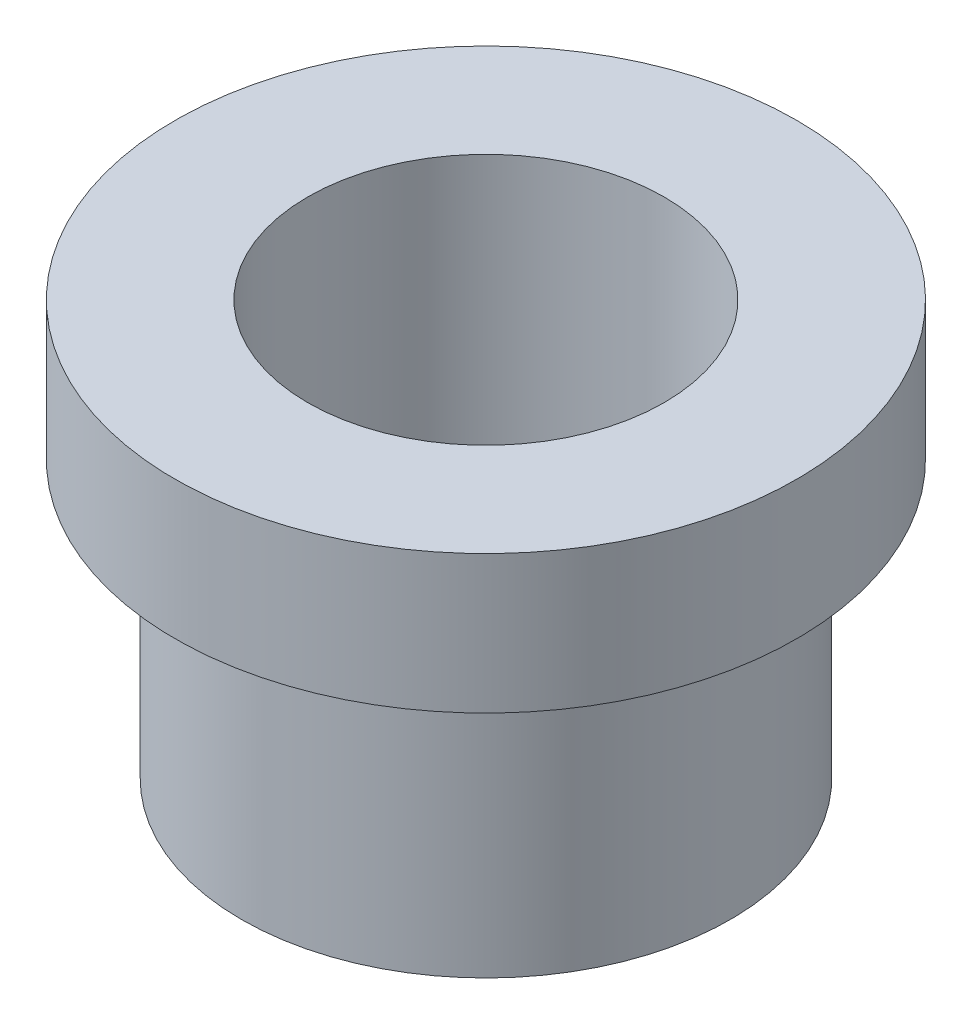
ISO-10303-21;
HEADER;
FILE_DESCRIPTION(('STEP AP214'),'2;1');
FILE_NAME('part.step','',(''),(''),'','','');
FILE_SCHEMA(('AUTOMOTIVE_DESIGN { 1 0 10303 214 1 1 1 1 }'));
ENDSEC;
DATA;
#1=APPLICATION_CONTEXT('core data for automotive mechanical design processes');
#2=APPLICATION_PROTOCOL_DEFINITION('international standard','automotive_design',2000,#1);
#3=PRODUCT_CONTEXT('',#1,'mechanical');
#4=PRODUCT('Part','Part','',(#3));
#5=PRODUCT_RELATED_PRODUCT_CATEGORY('part','',(#4));
#6=PRODUCT_DEFINITION_FORMATION('','',#4);
#7=PRODUCT_DEFINITION_CONTEXT('part definition',#1,'design');
#8=PRODUCT_DEFINITION('design','',#6,#7);
#9=PRODUCT_DEFINITION_SHAPE('','',#8);
#10=(LENGTH_UNIT() NAMED_UNIT(*) SI_UNIT(.MILLI.,.METRE.));
#11=(NAMED_UNIT(*) PLANE_ANGLE_UNIT() SI_UNIT($,.RADIAN.));
#12=(NAMED_UNIT(*) SI_UNIT($,.STERADIAN.) SOLID_ANGLE_UNIT());
#13=UNCERTAINTY_MEASURE_WITH_UNIT(LENGTH_MEASURE(1.E-05),#10,'distance_accuracy_value','');
#14=(GEOMETRIC_REPRESENTATION_CONTEXT(3) GLOBAL_UNCERTAINTY_ASSIGNED_CONTEXT((#13)) GLOBAL_UNIT_ASSIGNED_CONTEXT((#10,
#11,#12)) REPRESENTATION_CONTEXT('',''));
#15=CARTESIAN_POINT('',(0.,0.,0.));
#16=DIRECTION('',(0.,0.,1.));
#17=DIRECTION('',(1.,0.,0.));
#18=AXIS2_PLACEMENT_3D('',#15,#16,#17);
#19=CARTESIAN_POINT('',(0.,12.7,0.));
#20=DIRECTION('',(0.,1.,0.));
#21=DIRECTION('',(0.,0.,1.));
#22=AXIS2_PLACEMENT_3D('',#19,#20,#21);
#23=PLANE('',#22);
#24=CARTESIAN_POINT('',(0.,12.7,0.));
#25=DIRECTION('',(0.,1.,0.));
#26=DIRECTION('',(0.,0.,1.));
#27=AXIS2_PLACEMENT_3D('',#24,#25,#26);
#28=CIRCLE('',#27,28.575);
#29=CARTESIAN_POINT('',(0.,12.7,-28.575));
#30=VERTEX_POINT('',#29);
#31=EDGE_CURVE('E11',#30,#30,#28,.T.);
#32=ORIENTED_EDGE('',*,*,#31,.T.);
#33=EDGE_LOOP('',(#32));
#34=FACE_BOUND('',#33,.T.);
#35=CARTESIAN_POINT('',(0.,12.7,0.));
#36=DIRECTION('',(0.,1.,0.));
#37=DIRECTION('',(0.,0.,1.));
#38=AXIS2_PLACEMENT_3D('',#35,#36,#37);
#39=CIRCLE('',#38,16.383);
#40=CARTESIAN_POINT('',(0.,12.7,-16.383));
#41=VERTEX_POINT('',#40);
#42=EDGE_CURVE('E62',#41,#41,#39,.T.);
#43=ORIENTED_EDGE('',*,*,#42,.F.);
#44=EDGE_LOOP('',(#43));
#45=FACE_BOUND('',#44,.T.);
#46=ADVANCED_FACE('F49',(#34,#45),#23,.T.);
#47=CARTESIAN_POINT('',(0.,0.,0.));
#48=DIRECTION('',(0.,1.,0.));
#49=DIRECTION('',(0.,0.,1.));
#50=AXIS2_PLACEMENT_3D('',#47,#48,#49);
#51=PLANE('',#50);
#52=CARTESIAN_POINT('',(0.,0.,0.));
#53=DIRECTION('',(0.,1.,0.));
#54=DIRECTION('',(0.,0.,1.));
#55=AXIS2_PLACEMENT_3D('',#52,#53,#54);
#56=CIRCLE('',#55,22.479);
#57=CARTESIAN_POINT('',(0.,0.,22.479));
#58=VERTEX_POINT('',#57);
#59=EDGE_CURVE('E68',#58,#58,#56,.T.);
#60=ORIENTED_EDGE('',*,*,#59,.T.);
#61=EDGE_LOOP('',(#60));
#62=FACE_BOUND('',#61,.T.);
#63=CARTESIAN_POINT('',(0.,0.,0.));
#64=DIRECTION('',(0.,1.,0.));
#65=DIRECTION('',(0.,0.,1.));
#66=AXIS2_PLACEMENT_3D('',#63,#64,#65);
#67=CIRCLE('',#66,28.575);
#68=CARTESIAN_POINT('',(0.,0.,-28.575));
#69=VERTEX_POINT('',#68);
#70=EDGE_CURVE('E53',#69,#69,#67,.T.);
#71=ORIENTED_EDGE('',*,*,#70,.F.);
#72=EDGE_LOOP('',(#71));
#73=FACE_BOUND('',#72,.T.);
#74=ADVANCED_FACE('F95',(#62,#73),#51,.F.);
#75=CARTESIAN_POINT('',(0.,12.7,0.));
#76=DIRECTION('',(0.,-1.,0.));
#77=DIRECTION('',(0.,0.,-1.));
#78=AXIS2_PLACEMENT_3D('',#75,#76,#77);
#79=CYLINDRICAL_SURFACE('',#78,28.575);
#80=CARTESIAN_POINT('',(0.,12.7,-28.575));
#81=CARTESIAN_POINT('',(0.,12.5677083333333,-28.575));
#82=CARTESIAN_POINT('',(0.,12.4354166666667,-28.575));
#83=CARTESIAN_POINT('',(0.,12.1708333333333,-28.575));
#84=CARTESIAN_POINT('',(0.,12.0385416666667,-28.575));
#85=CARTESIAN_POINT('',(0.,11.7739583333333,-28.575));
#86=CARTESIAN_POINT('',(0.,11.6416666666667,-28.575));
#87=CARTESIAN_POINT('',(0.,11.3770833333333,-28.575));
#88=CARTESIAN_POINT('',(0.,11.2447916666667,-28.575));
#89=CARTESIAN_POINT('',(0.,10.9802083333333,-28.575));
#90=CARTESIAN_POINT('',(0.,10.8479166666667,-28.575));
#91=CARTESIAN_POINT('',(0.,10.5833333333333,-28.575));
#92=CARTESIAN_POINT('',(0.,10.4510416666667,-28.575));
#93=CARTESIAN_POINT('',(0.,10.1864583333333,-28.575));
#94=CARTESIAN_POINT('',(0.,10.0541666666667,-28.575));
#95=CARTESIAN_POINT('',(0.,9.78958333333333,-28.575));
#96=CARTESIAN_POINT('',(0.,9.65729166666667,-28.575));
#97=CARTESIAN_POINT('',(0.,9.39270833333333,-28.575));
#98=CARTESIAN_POINT('',(0.,9.26041666666667,-28.575));
#99=CARTESIAN_POINT('',(0.,8.99583333333334,-28.575));
#100=CARTESIAN_POINT('',(0.,8.86354166666667,-28.575));
#101=CARTESIAN_POINT('',(0.,8.59895833333334,-28.575));
#102=CARTESIAN_POINT('',(0.,8.46666666666667,-28.575));
#103=CARTESIAN_POINT('',(0.,8.20208333333333,-28.575));
#104=CARTESIAN_POINT('',(0.,8.06979166666667,-28.575));
#105=CARTESIAN_POINT('',(0.,7.80520833333333,-28.575));
#106=CARTESIAN_POINT('',(0.,7.67291666666667,-28.575));
#107=CARTESIAN_POINT('',(0.,7.40833333333333,-28.575));
#108=CARTESIAN_POINT('',(0.,7.27604166666667,-28.575));
#109=CARTESIAN_POINT('',(0.,7.01145833333333,-28.575));
#110=CARTESIAN_POINT('',(0.,6.87916666666667,-28.575));
#111=CARTESIAN_POINT('',(0.,6.61458333333333,-28.575));
#112=CARTESIAN_POINT('',(0.,6.48229166666667,-28.575));
#113=CARTESIAN_POINT('',(0.,6.21770833333333,-28.575));
#114=CARTESIAN_POINT('',(0.,6.08541666666667,-28.575));
#115=CARTESIAN_POINT('',(0.,5.82083333333333,-28.575));
#116=CARTESIAN_POINT('',(0.,5.68854166666667,-28.575));
#117=CARTESIAN_POINT('',(0.,5.42395833333333,-28.575));
#118=CARTESIAN_POINT('',(0.,5.29166666666667,-28.575));
#119=CARTESIAN_POINT('',(0.,5.02708333333333,-28.575));
#120=CARTESIAN_POINT('',(0.,4.89479166666667,-28.575));
#121=CARTESIAN_POINT('',(0.,4.63020833333333,-28.575));
#122=CARTESIAN_POINT('',(0.,4.49791666666667,-28.575));
#123=CARTESIAN_POINT('',(0.,4.23333333333333,-28.575));
#124=CARTESIAN_POINT('',(0.,4.10104166666667,-28.575));
#125=CARTESIAN_POINT('',(0.,3.83645833333333,-28.575));
#126=CARTESIAN_POINT('',(0.,3.70416666666667,-28.575));
#127=CARTESIAN_POINT('',(0.,3.43958333333333,-28.575));
#128=CARTESIAN_POINT('',(0.,3.30729166666667,-28.575));
#129=CARTESIAN_POINT('',(0.,3.04270833333333,-28.575));
#130=CARTESIAN_POINT('',(0.,2.91041666666667,-28.575));
#131=CARTESIAN_POINT('',(0.,2.64583333333333,-28.575));
#132=CARTESIAN_POINT('',(0.,2.51354166666667,-28.575));
#133=CARTESIAN_POINT('',(0.,2.24895833333333,-28.575));
#134=CARTESIAN_POINT('',(0.,2.11666666666667,-28.575));
#135=CARTESIAN_POINT('',(0.,1.85208333333333,-28.575));
#136=CARTESIAN_POINT('',(0.,1.71979166666667,-28.575));
#137=CARTESIAN_POINT('',(0.,1.45520833333333,-28.575));
#138=CARTESIAN_POINT('',(0.,1.32291666666667,-28.575));
#139=CARTESIAN_POINT('',(0.,1.05833333333333,-28.575));
#140=CARTESIAN_POINT('',(0.,0.926041666666666,-28.575));
#141=CARTESIAN_POINT('',(0.,0.661458333333333,-28.575));
#142=CARTESIAN_POINT('',(0.,0.529166666666666,-28.575));
#143=CARTESIAN_POINT('',(0.,0.264583333333333,-28.575));
#144=CARTESIAN_POINT('',(0.,0.132291666666667,-28.575));
#145=CARTESIAN_POINT('',(0.,0.,-28.575));
#146=B_SPLINE_CURVE_WITH_KNOTS('',3,(#80,#81,#82,#83,#84,#85,#86,#87,#88,#89,#90,#91,#92,#93,
#94,#95,#96,#97,#98,#99,#100,#101,#102,#103,#104,#105,#106,#107,#108,#109,#110,#111,#112,#113,
#114,#115,#116,#117,#118,#119,#120,#121,#122,#123,#124,#125,#126,#127,#128,#129,#130,#131,#132,
#133,#134,#135,#136,#137,#138,#139,#140,#141,#142,#143,#144,#145),.UNSPECIFIED.,.F.,.F.,(4,2,2,
2,2,2,2,2,2,2,2,2,2,2,2,2,2,2,2,2,2,2,2,2,2,2,2,2,2,2,2,2,4),(0.,0.396875,0.793749999999999,
1.190625,1.5875,1.984375,2.38125,2.778125,3.175,3.571875,3.96875,4.365625,4.7625,5.159375,
5.55625,5.953125,6.35,6.746875,7.14375,7.540625,7.9375,8.334375,8.73125,9.128125,9.525,9.921875,
10.31875,10.715625,11.1125,11.509375,11.90625,12.303125,12.7),.UNSPECIFIED.);
#147=EDGE_CURVE('BSEAM51',#30,#69,#146,.T.);
#148=ORIENTED_EDGE('',*,*,#31,.F.);
#149=ORIENTED_EDGE('',*,*,#70,.T.);
#150=ORIENTED_EDGE('',*,*,#147,.T.);
#151=ORIENTED_EDGE('',*,*,#147,.F.);
#152=EDGE_LOOP('',(#148,#150,#149,#151));
#153=FACE_BOUND('',#152,.T.);
#154=ADVANCED_FACE('F51',(#153),#79,.T.);
#155=CARTESIAN_POINT('',(0.,12.7,0.));
#156=DIRECTION('',(0.,-1.,0.));
#157=DIRECTION('',(0.,0.,-1.));
#158=AXIS2_PLACEMENT_3D('',#155,#156,#157);
#159=CYLINDRICAL_SURFACE('',#158,16.383);
#160=CARTESIAN_POINT('',(0.,-25.4,0.));
#161=DIRECTION('',(0.,1.,0.));
#162=DIRECTION('',(0.,0.,1.));
#163=AXIS2_PLACEMENT_3D('',#160,#161,#162);
#164=CIRCLE('',#163,16.383);
#165=CARTESIAN_POINT('',(0.,-25.4,-16.383));
#166=VERTEX_POINT('',#165);
#167=EDGE_CURVE('E72',#166,#166,#164,.T.);
#168=CARTESIAN_POINT('',(0.,12.7,-16.383));
#169=CARTESIAN_POINT('',(0.,12.303125,-16.383));
#170=CARTESIAN_POINT('',(0.,11.90625,-16.383));
#171=CARTESIAN_POINT('',(0.,11.1125,-16.383));
#172=CARTESIAN_POINT('',(0.,10.715625,-16.383));
#173=CARTESIAN_POINT('',(0.,9.921875,-16.383));
#174=CARTESIAN_POINT('',(0.,9.525,-16.383));
#175=CARTESIAN_POINT('',(0.,8.73125,-16.383));
#176=CARTESIAN_POINT('',(0.,8.334375,-16.383));
#177=CARTESIAN_POINT('',(0.,7.540625,-16.383));
#178=CARTESIAN_POINT('',(0.,7.14375,-16.383));
#179=CARTESIAN_POINT('',(0.,6.35,-16.383));
#180=CARTESIAN_POINT('',(0.,5.953125,-16.383));
#181=CARTESIAN_POINT('',(0.,5.159375,-16.383));
#182=CARTESIAN_POINT('',(0.,4.7625,-16.383));
#183=CARTESIAN_POINT('',(0.,3.96875,-16.383));
#184=CARTESIAN_POINT('',(0.,3.571875,-16.383));
#185=CARTESIAN_POINT('',(0.,2.778125,-16.383));
#186=CARTESIAN_POINT('',(0.,2.38125,-16.383));
#187=CARTESIAN_POINT('',(0.,1.5875,-16.383));
#188=CARTESIAN_POINT('',(0.,1.190625,-16.383));
#189=CARTESIAN_POINT('',(0.,0.396875,-16.383));
#190=CARTESIAN_POINT('',(0.,0.,-16.383));
#191=CARTESIAN_POINT('',(0.,-0.79375,-16.383));
#192=CARTESIAN_POINT('',(0.,-1.190625,-16.383));
#193=CARTESIAN_POINT('',(0.,-1.984375,-16.383));
#194=CARTESIAN_POINT('',(0.,-2.38125,-16.383));
#195=CARTESIAN_POINT('',(0.,-3.175,-16.383));
#196=CARTESIAN_POINT('',(0.,-3.571875,-16.383));
#197=CARTESIAN_POINT('',(0.,-4.365625,-16.383));
#198=CARTESIAN_POINT('',(0.,-4.7625,-16.383));
#199=CARTESIAN_POINT('',(0.,-5.55625,-16.383));
#200=CARTESIAN_POINT('',(0.,-5.953125,-16.383));
#201=CARTESIAN_POINT('',(0.,-6.746875,-16.383));
#202=CARTESIAN_POINT('',(0.,-7.14375,-16.383));
#203=CARTESIAN_POINT('',(0.,-7.9375,-16.383));
#204=CARTESIAN_POINT('',(0.,-8.334375,-16.383));
#205=CARTESIAN_POINT('',(0.,-9.128125,-16.383));
#206=CARTESIAN_POINT('',(0.,-9.525,-16.383));
#207=CARTESIAN_POINT('',(0.,-10.31875,-16.383));
#208=CARTESIAN_POINT('',(0.,-10.715625,-16.383));
#209=CARTESIAN_POINT('',(0.,-11.509375,-16.383));
#210=CARTESIAN_POINT('',(0.,-11.90625,-16.383));
#211=CARTESIAN_POINT('',(0.,-12.7,-16.383));
#212=CARTESIAN_POINT('',(0.,-13.096875,-16.383));
#213=CARTESIAN_POINT('',(0.,-13.890625,-16.383));
#214=CARTESIAN_POINT('',(0.,-14.2875,-16.383));
#215=CARTESIAN_POINT('',(0.,-15.08125,-16.383));
#216=CARTESIAN_POINT('',(0.,-15.478125,-16.383));
#217=CARTESIAN_POINT('',(0.,-16.271875,-16.383));
#218=CARTESIAN_POINT('',(0.,-16.66875,-16.383));
#219=CARTESIAN_POINT('',(0.,-17.4625,-16.383));
#220=CARTESIAN_POINT('',(0.,-17.859375,-16.383));
#221=CARTESIAN_POINT('',(0.,-18.653125,-16.383));
#222=CARTESIAN_POINT('',(0.,-19.05,-16.383));
#223=CARTESIAN_POINT('',(0.,-19.84375,-16.383));
#224=CARTESIAN_POINT('',(0.,-20.240625,-16.383));
#225=CARTESIAN_POINT('',(0.,-21.034375,-16.383));
#226=CARTESIAN_POINT('',(0.,-21.43125,-16.383));
#227=CARTESIAN_POINT('',(0.,-22.225,-16.383));
#228=CARTESIAN_POINT('',(0.,-22.621875,-16.383));
#229=CARTESIAN_POINT('',(0.,-23.415625,-16.383));
#230=CARTESIAN_POINT('',(0.,-23.8125,-16.383));
#231=CARTESIAN_POINT('',(0.,-24.60625,-16.383));
#232=CARTESIAN_POINT('',(0.,-25.003125,-16.383));
#233=CARTESIAN_POINT('',(0.,-25.4,-16.383));
#234=B_SPLINE_CURVE_WITH_KNOTS('',3,(#168,#169,#170,#171,#172,#173,#174,#175,#176,#177,#178,
#179,#180,#181,#182,#183,#184,#185,#186,#187,#188,#189,#190,#191,#192,#193,#194,#195,#196,#197,
#198,#199,#200,#201,#202,#203,#204,#205,#206,#207,#208,#209,#210,#211,#212,#213,#214,#215,#216,
#217,#218,#219,#220,#221,#222,#223,#224,#225,#226,#227,#228,#229,#230,#231,#232,#233),
.UNSPECIFIED.,.F.,.F.,(4,2,2,2,2,2,2,2,2,2,2,2,2,2,2,2,2,2,2,2,2,2,2,2,2,2,2,2,2,2,2,2,4),(0.,
1.190625,2.38125,3.571875,4.7625,5.953125,7.14375,8.334375,9.525,10.715625,11.90625,13.096875,
14.2875,15.478125,16.66875,17.859375,19.05,20.240625,21.43125,22.621875,23.8125,25.003125,
26.19375,27.384375,28.575,29.765625,30.95625,32.146875,33.3375,34.528125,35.71875,36.909375,
38.1),.UNSPECIFIED.);
#235=EDGE_CURVE('BSEAM83',#41,#166,#234,.T.);
#236=ORIENTED_EDGE('',*,*,#42,.T.);
#237=ORIENTED_EDGE('',*,*,#167,.F.);
#238=ORIENTED_EDGE('',*,*,#235,.T.);
#239=ORIENTED_EDGE('',*,*,#235,.F.);
#240=EDGE_LOOP('',(#236,#238,#237,#239));
#241=FACE_BOUND('',#240,.T.);
#242=ADVANCED_FACE('F83',(#241),#159,.F.);
#243=CARTESIAN_POINT('',(0.,-25.4,0.));
#244=DIRECTION('',(0.,1.,0.));
#245=DIRECTION('',(0.,0.,1.));
#246=AXIS2_PLACEMENT_3D('',#243,#244,#245);
#247=CYLINDRICAL_SURFACE('',#246,22.479);
#248=CARTESIAN_POINT('',(0.,-25.4,0.));
#249=DIRECTION('',(0.,1.,0.));
#250=DIRECTION('',(0.,0.,1.));
#251=AXIS2_PLACEMENT_3D('',#248,#249,#250);
#252=CIRCLE('',#251,22.479);
#253=CARTESIAN_POINT('',(0.,-25.4,22.479));
#254=VERTEX_POINT('',#253);
#255=EDGE_CURVE('E67',#254,#254,#252,.T.);
#256=ORIENTED_EDGE('',*,*,#255,.T.);
#257=EDGE_LOOP('',(#256));
#258=FACE_BOUND('',#257,.T.);
#259=ORIENTED_EDGE('',*,*,#59,.F.);
#260=EDGE_LOOP('',(#259));
#261=FACE_BOUND('',#260,.T.);
#262=ADVANCED_FACE('F85',(#258,#261),#247,.T.);
#263=CARTESIAN_POINT('',(0.,-25.4,0.));
#264=DIRECTION('',(0.,1.,0.));
#265=DIRECTION('',(0.,0.,1.));
#266=AXIS2_PLACEMENT_3D('',#263,#264,#265);
#267=PLANE('',#266);
#268=ORIENTED_EDGE('',*,*,#167,.T.);
#269=EDGE_LOOP('',(#268));
#270=FACE_BOUND('',#269,.T.);
#271=ORIENTED_EDGE('',*,*,#255,.F.);
#272=EDGE_LOOP('',(#271));
#273=FACE_BOUND('',#272,.T.);
#274=ADVANCED_FACE('F80',(#270,#273),#267,.F.);
#275=CLOSED_SHELL('',(#46,#74,#154,#242,#262,#274));
#276=MANIFOLD_SOLID_BREP('B2',#275);
#277=ADVANCED_BREP_SHAPE_REPRESENTATION('',(#18,#276),#14);
#278=SHAPE_DEFINITION_REPRESENTATION(#9,#277);
ENDSEC;
END-ISO-10303-21;
